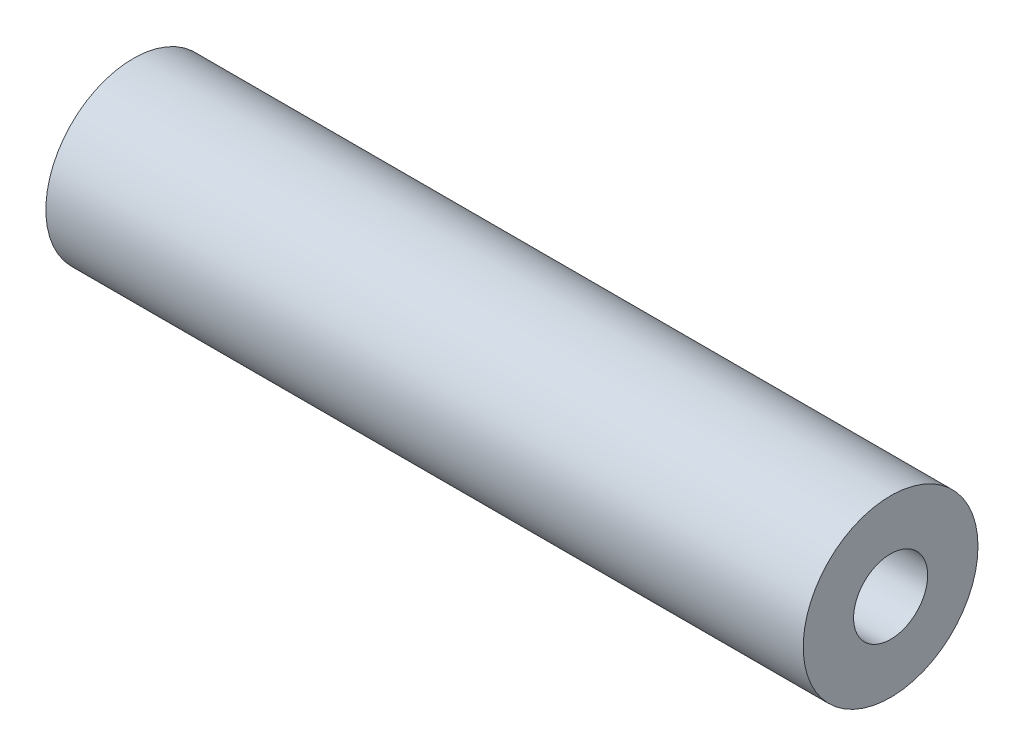
ISO-10303-21;
HEADER;
FILE_DESCRIPTION(('STEP AP214'),'2;1');
FILE_NAME('part.step','',(''),(''),'','','');
FILE_SCHEMA(('AUTOMOTIVE_DESIGN { 1 0 10303 214 1 1 1 1 }'));
ENDSEC;
DATA;
#1=APPLICATION_CONTEXT('core data for automotive mechanical design processes');
#2=APPLICATION_PROTOCOL_DEFINITION('international standard','automotive_design',2000,#1);
#3=PRODUCT_CONTEXT('',#1,'mechanical');
#4=PRODUCT('Part','Part','',(#3));
#5=PRODUCT_RELATED_PRODUCT_CATEGORY('part','',(#4));
#6=PRODUCT_DEFINITION_FORMATION('','',#4);
#7=PRODUCT_DEFINITION_CONTEXT('part definition',#1,'design');
#8=PRODUCT_DEFINITION('design','',#6,#7);
#9=PRODUCT_DEFINITION_SHAPE('','',#8);
#10=(LENGTH_UNIT() NAMED_UNIT(*) SI_UNIT(.MILLI.,.METRE.));
#11=(NAMED_UNIT(*) PLANE_ANGLE_UNIT() SI_UNIT($,.RADIAN.));
#12=(NAMED_UNIT(*) SI_UNIT($,.STERADIAN.) SOLID_ANGLE_UNIT());
#13=UNCERTAINTY_MEASURE_WITH_UNIT(LENGTH_MEASURE(1.E-05),#10,'distance_accuracy_value','');
#14=(GEOMETRIC_REPRESENTATION_CONTEXT(3) GLOBAL_UNCERTAINTY_ASSIGNED_CONTEXT((#13)) GLOBAL_UNIT_ASSIGNED_CONTEXT((#10,
#11,#12)) REPRESENTATION_CONTEXT('',''));
#15=CARTESIAN_POINT('',(0.,0.,0.));
#16=DIRECTION('',(0.,0.,1.));
#17=DIRECTION('',(1.,0.,0.));
#18=AXIS2_PLACEMENT_3D('',#15,#16,#17);
#19=CARTESIAN_POINT('',(20.6375,0.,0.));
#20=DIRECTION('',(-1.,0.,0.));
#21=DIRECTION('',(0.,0.,1.));
#22=AXIS2_PLACEMENT_3D('',#19,#20,#21);
#23=CYLINDRICAL_SURFACE('',#22,4.7625);
#24=CARTESIAN_POINT('',(20.6375,0.,0.));
#25=DIRECTION('',(1.,0.,0.));
#26=DIRECTION('',(0.,0.,-1.));
#27=AXIS2_PLACEMENT_3D('',#24,#25,#26);
#28=CIRCLE('',#27,4.7625);
#29=CARTESIAN_POINT('',(20.6375,0.,-4.7625));
#30=VERTEX_POINT('',#29);
#31=EDGE_CURVE('E11',#30,#30,#28,.T.);
#32=ORIENTED_EDGE('',*,*,#31,.F.);
#33=EDGE_LOOP('',(#32));
#34=FACE_BOUND('',#33,.T.);
#35=CARTESIAN_POINT('',(-20.6375,0.,0.));
#36=DIRECTION('',(1.,0.,0.));
#37=DIRECTION('',(0.,0.,-1.));
#38=AXIS2_PLACEMENT_3D('',#35,#36,#37);
#39=CIRCLE('',#38,4.7625);
#40=CARTESIAN_POINT('',(-20.6375,0.,-4.7625));
#41=VERTEX_POINT('',#40);
#42=EDGE_CURVE('E48',#41,#41,#39,.T.);
#43=ORIENTED_EDGE('',*,*,#42,.T.);
#44=EDGE_LOOP('',(#43));
#45=FACE_BOUND('',#44,.T.);
#46=ADVANCED_FACE('F45',(#34,#45),#23,.T.);
#47=CARTESIAN_POINT('',(20.6375,0.,0.));
#48=DIRECTION('',(1.,0.,0.));
#49=DIRECTION('',(0.,0.,-1.));
#50=AXIS2_PLACEMENT_3D('',#47,#48,#49);
#51=PLANE('',#50);
#52=CARTESIAN_POINT('',(20.6375,0.,0.));
#53=DIRECTION('',(1.,0.,0.));
#54=DIRECTION('',(0.,0.,-1.));
#55=AXIS2_PLACEMENT_3D('',#52,#53,#54);
#56=CIRCLE('',#55,2.01929999999999);
#57=CARTESIAN_POINT('',(20.6375,0.,-2.01929999999999));
#58=VERTEX_POINT('',#57);
#59=EDGE_CURVE('E69',#58,#58,#56,.T.);
#60=ORIENTED_EDGE('',*,*,#59,.F.);
#61=EDGE_LOOP('',(#60));
#62=FACE_BOUND('',#61,.T.);
#63=ORIENTED_EDGE('',*,*,#31,.T.);
#64=EDGE_LOOP('',(#63));
#65=FACE_BOUND('',#64,.T.);
#66=ADVANCED_FACE('F87',(#62,#65),#51,.T.);
#67=CARTESIAN_POINT('',(-20.6375,0.,0.));
#68=DIRECTION('',(1.,0.,0.));
#69=DIRECTION('',(0.,0.,-1.));
#70=AXIS2_PLACEMENT_3D('',#67,#68,#69);
#71=PLANE('',#70);
#72=CARTESIAN_POINT('',(-20.6375,0.,0.));
#73=DIRECTION('',(-1.,0.,0.));
#74=DIRECTION('',(0.,0.,1.));
#75=AXIS2_PLACEMENT_3D('',#72,#73,#74);
#76=CIRCLE('',#75,2.01929999999999);
#77=CARTESIAN_POINT('',(-20.6375,0.,2.01929999999999));
#78=VERTEX_POINT('',#77);
#79=EDGE_CURVE('E68',#78,#78,#76,.T.);
#80=ORIENTED_EDGE('',*,*,#79,.F.);
#81=EDGE_LOOP('',(#80));
#82=FACE_BOUND('',#81,.T.);
#83=ORIENTED_EDGE('',*,*,#42,.F.);
#84=EDGE_LOOP('',(#83));
#85=FACE_BOUND('',#84,.T.);
#86=ADVANCED_FACE('F84',(#82,#85),#71,.F.);
#87=CARTESIAN_POINT('',(-4.38150000000001,0.,0.));
#88=DIRECTION('',(-1.,0.,0.));
#89=DIRECTION('',(0.,0.,1.));
#90=AXIS2_PLACEMENT_3D('',#87,#88,#89);
#91=CONICAL_SURFACE('',#90,2.01929999999999,1.02974425867665);
#92=CARTESIAN_POINT('',(-3.16818215199765,0.,0.));
#93=VERTEX_POINT('',#92);
#94=VERTEX_LOOP('',#93);
#95=FACE_BOUND('',#94,.T.);
#96=CARTESIAN_POINT('',(-4.38150000000001,0.,0.));
#97=DIRECTION('',(-1.,0.,0.));
#98=DIRECTION('',(0.,0.,1.));
#99=AXIS2_PLACEMENT_3D('',#96,#97,#98);
#100=CIRCLE('',#99,2.01929999999999);
#101=CARTESIAN_POINT('',(-4.38150000000001,0.,2.01929999999999));
#102=VERTEX_POINT('',#101);
#103=EDGE_CURVE('E72',#102,#102,#100,.T.);
#104=ORIENTED_EDGE('',*,*,#103,.T.);
#105=EDGE_LOOP('',(#104));
#106=FACE_BOUND('',#105,.T.);
#107=ADVANCED_FACE('F86',(#95,#106),#91,.F.);
#108=CARTESIAN_POINT('',(-20.6375,0.,0.));
#109=DIRECTION('',(-1.,0.,0.));
#110=DIRECTION('',(0.,0.,1.));
#111=AXIS2_PLACEMENT_3D('',#108,#109,#110);
#112=CYLINDRICAL_SURFACE('',#111,2.01929999999999);
#113=ORIENTED_EDGE('',*,*,#103,.F.);
#114=EDGE_LOOP('',(#113));
#115=FACE_BOUND('',#114,.T.);
#116=ORIENTED_EDGE('',*,*,#79,.T.);
#117=EDGE_LOOP('',(#116));
#118=FACE_BOUND('',#117,.T.);
#119=ADVANCED_FACE('F62',(#115,#118),#112,.F.);
#120=CARTESIAN_POINT('',(4.38150000000001,0.,0.));
#121=DIRECTION('',(1.,0.,0.));
#122=DIRECTION('',(0.,0.,-1.));
#123=AXIS2_PLACEMENT_3D('',#120,#121,#122);
#124=CONICAL_SURFACE('',#123,2.01929999999999,1.02974425867665);
#125=CARTESIAN_POINT('',(3.16818215199765,0.,0.));
#126=VERTEX_POINT('',#125);
#127=VERTEX_LOOP('',#126);
#128=FACE_BOUND('',#127,.T.);
#129=CARTESIAN_POINT('',(4.38150000000001,0.,0.));
#130=DIRECTION('',(1.,0.,0.));
#131=DIRECTION('',(0.,0.,-1.));
#132=AXIS2_PLACEMENT_3D('',#129,#130,#131);
#133=CIRCLE('',#132,2.01929999999999);
#134=CARTESIAN_POINT('',(4.38150000000001,0.,-2.01929999999999));
#135=VERTEX_POINT('',#134);
#136=EDGE_CURVE('E66',#135,#135,#133,.T.);
#137=ORIENTED_EDGE('',*,*,#136,.T.);
#138=EDGE_LOOP('',(#137));
#139=FACE_BOUND('',#138,.T.);
#140=ADVANCED_FACE('F58',(#128,#139),#124,.F.);
#141=CARTESIAN_POINT('',(20.6375,0.,0.));
#142=DIRECTION('',(1.,0.,0.));
#143=DIRECTION('',(0.,0.,-1.));
#144=AXIS2_PLACEMENT_3D('',#141,#142,#143);
#145=CYLINDRICAL_SURFACE('',#144,2.01929999999999);
#146=ORIENTED_EDGE('',*,*,#136,.F.);
#147=EDGE_LOOP('',(#146));
#148=FACE_BOUND('',#147,.T.);
#149=ORIENTED_EDGE('',*,*,#59,.T.);
#150=EDGE_LOOP('',(#149));
#151=FACE_BOUND('',#150,.T.);
#152=ADVANCED_FACE('F61',(#148,#151),#145,.F.);
#153=CLOSED_SHELL('',(#46,#66,#86,#107,#119,#140,#152));
#154=MANIFOLD_SOLID_BREP('B2',#153);
#155=ADVANCED_BREP_SHAPE_REPRESENTATION('',(#18,#154),#14);
#156=SHAPE_DEFINITION_REPRESENTATION(#9,#155);
ENDSEC;
END-ISO-10303-21;
